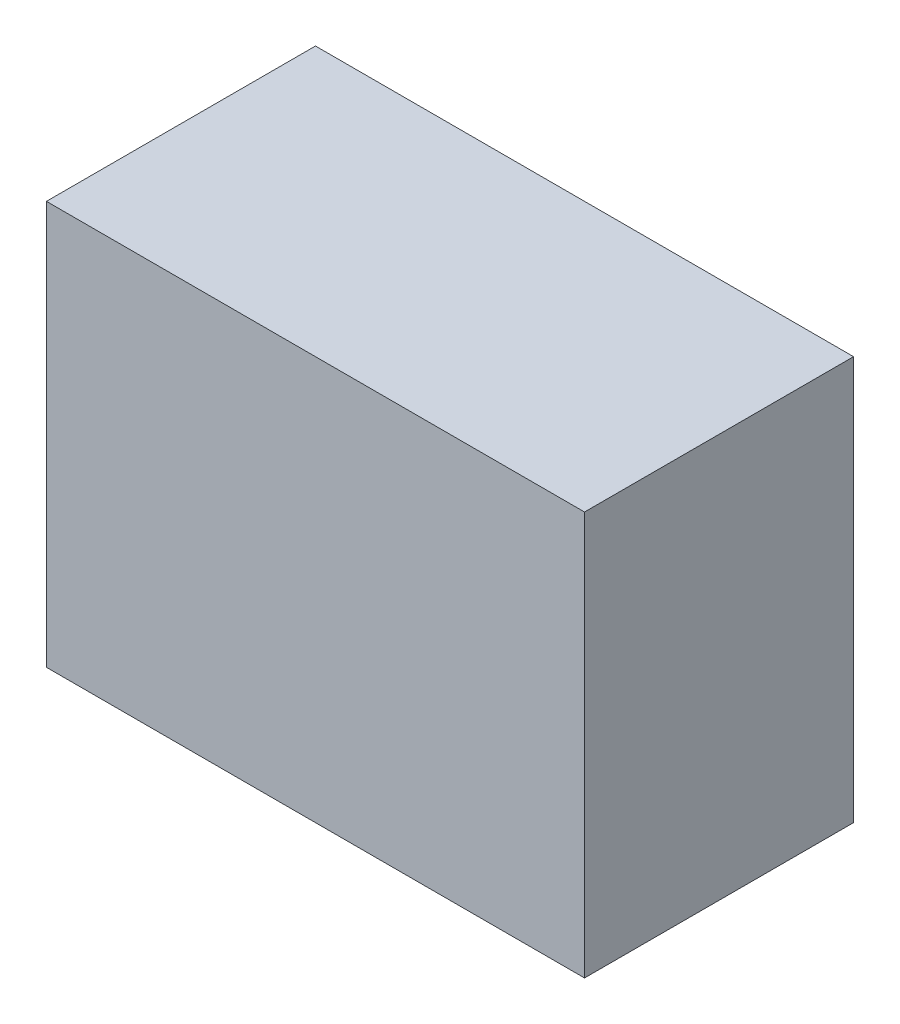
ISO-10303-21;
HEADER;
FILE_DESCRIPTION(('STEP AP214'),'2;1');
FILE_NAME('part.step','',(''),(''),'','','');
FILE_SCHEMA(('AUTOMOTIVE_DESIGN { 1 0 10303 214 1 1 1 1 }'));
ENDSEC;
DATA;
#1=APPLICATION_CONTEXT('core data for automotive mechanical design processes');
#2=APPLICATION_PROTOCOL_DEFINITION('international standard','automotive_design',2000,#1);
#3=PRODUCT_CONTEXT('',#1,'mechanical');
#4=PRODUCT('Part','Part','',(#3));
#5=PRODUCT_RELATED_PRODUCT_CATEGORY('part','',(#4));
#6=PRODUCT_DEFINITION_FORMATION('','',#4);
#7=PRODUCT_DEFINITION_CONTEXT('part definition',#1,'design');
#8=PRODUCT_DEFINITION('design','',#6,#7);
#9=PRODUCT_DEFINITION_SHAPE('','',#8);
#10=(LENGTH_UNIT() NAMED_UNIT(*) SI_UNIT(.MILLI.,.METRE.));
#11=(NAMED_UNIT(*) PLANE_ANGLE_UNIT() SI_UNIT($,.RADIAN.));
#12=(NAMED_UNIT(*) SI_UNIT($,.STERADIAN.) SOLID_ANGLE_UNIT());
#13=UNCERTAINTY_MEASURE_WITH_UNIT(LENGTH_MEASURE(1.E-05),#10,'distance_accuracy_value','');
#14=(GEOMETRIC_REPRESENTATION_CONTEXT(3) GLOBAL_UNCERTAINTY_ASSIGNED_CONTEXT((#13)) GLOBAL_UNIT_ASSIGNED_CONTEXT((#10,
#11,#12)) REPRESENTATION_CONTEXT('',''));
#15=CARTESIAN_POINT('',(0.,0.,0.));
#16=DIRECTION('',(0.,0.,1.));
#17=DIRECTION('',(1.,0.,0.));
#18=AXIS2_PLACEMENT_3D('',#15,#16,#17);
#19=CARTESIAN_POINT('',(10.,-7.5,-10.));
#20=DIRECTION('',(1.,0.,0.));
#21=DIRECTION('',(0.,0.,-1.));
#22=AXIS2_PLACEMENT_3D('',#19,#20,#21);
#23=PLANE('',#22);
#24=DIRECTION('',(0.,1.,0.));
#25=VECTOR('',#24,1.);
#26=CARTESIAN_POINT('',(10.,-7.5,0.));
#27=LINE('',#26,#25);
#28=CARTESIAN_POINT('',(10.,-7.5,0.));
#29=VERTEX_POINT('',#28);
#30=CARTESIAN_POINT('',(10.,7.5,0.));
#31=VERTEX_POINT('',#30);
#32=EDGE_CURVE('E103',#29,#31,#27,.T.);
#33=ORIENTED_EDGE('',*,*,#32,.F.);
#34=DIRECTION('',(0.,0.,1.));
#35=VECTOR('',#34,1.);
#36=CARTESIAN_POINT('',(10.,-7.5,-10.));
#37=LINE('',#36,#35);
#38=CARTESIAN_POINT('',(10.,-7.5,-10.));
#39=VERTEX_POINT('',#38);
#40=EDGE_CURVE('E11',#39,#29,#37,.T.);
#41=ORIENTED_EDGE('',*,*,#40,.F.);
#42=DIRECTION('',(0.,1.,0.));
#43=VECTOR('',#42,1.);
#44=CARTESIAN_POINT('',(10.,-7.5,-10.));
#45=LINE('',#44,#43);
#46=CARTESIAN_POINT('',(10.,7.5,-10.));
#47=VERTEX_POINT('',#46);
#48=EDGE_CURVE('E100',#39,#47,#45,.T.);
#49=ORIENTED_EDGE('',*,*,#48,.T.);
#50=DIRECTION('',(0.,0.,1.));
#51=VECTOR('',#50,1.);
#52=CARTESIAN_POINT('',(10.,7.5,-10.));
#53=LINE('',#52,#51);
#54=EDGE_CURVE('E45',#47,#31,#53,.T.);
#55=ORIENTED_EDGE('',*,*,#54,.T.);
#56=EDGE_LOOP('',(#33,#41,#49,#55));
#57=FACE_BOUND('',#56,.T.);
#58=ADVANCED_FACE('F39',(#57),#23,.T.);
#59=CARTESIAN_POINT('',(-10.,-7.5,-10.));
#60=DIRECTION('',(0.,-1.,0.));
#61=DIRECTION('',(0.,0.,-1.));
#62=AXIS2_PLACEMENT_3D('',#59,#60,#61);
#63=PLANE('',#62);
#64=DIRECTION('',(1.,0.,0.));
#65=VECTOR('',#64,1.);
#66=CARTESIAN_POINT('',(-10.,-7.5,0.));
#67=LINE('',#66,#65);
#68=CARTESIAN_POINT('',(-10.,-7.5,0.));
#69=VERTEX_POINT('',#68);
#70=EDGE_CURVE('E97',#69,#29,#67,.T.);
#71=ORIENTED_EDGE('',*,*,#70,.F.);
#72=DIRECTION('',(0.,0.,1.));
#73=VECTOR('',#72,1.);
#74=CARTESIAN_POINT('',(-10.,-7.5,-10.));
#75=LINE('',#74,#73);
#76=CARTESIAN_POINT('',(-10.,-7.5,-10.));
#77=VERTEX_POINT('',#76);
#78=EDGE_CURVE('E48',#77,#69,#75,.T.);
#79=ORIENTED_EDGE('',*,*,#78,.F.);
#80=DIRECTION('',(1.,0.,0.));
#81=VECTOR('',#80,1.);
#82=CARTESIAN_POINT('',(-10.,-7.5,-10.));
#83=LINE('',#82,#81);
#84=EDGE_CURVE('E94',#77,#39,#83,.T.);
#85=ORIENTED_EDGE('',*,*,#84,.T.);
#86=ORIENTED_EDGE('',*,*,#40,.T.);
#87=EDGE_LOOP('',(#71,#79,#85,#86));
#88=FACE_BOUND('',#87,.T.);
#89=ADVANCED_FACE('F114',(#88),#63,.T.);
#90=CARTESIAN_POINT('',(-10.,-7.5,-10.));
#91=DIRECTION('',(-1.,0.,0.));
#92=DIRECTION('',(0.,0.,1.));
#93=AXIS2_PLACEMENT_3D('',#90,#91,#92);
#94=PLANE('',#93);
#95=DIRECTION('',(0.,-1.,0.));
#96=VECTOR('',#95,1.);
#97=CARTESIAN_POINT('',(-10.,-7.5,0.));
#98=LINE('',#97,#96);
#99=CARTESIAN_POINT('',(-10.,7.5,0.));
#100=VERTEX_POINT('',#99);
#101=EDGE_CURVE('E90',#100,#69,#98,.T.);
#102=ORIENTED_EDGE('',*,*,#101,.F.);
#103=DIRECTION('',(0.,0.,1.));
#104=VECTOR('',#103,1.);
#105=CARTESIAN_POINT('',(-10.,7.5,-10.));
#106=LINE('',#105,#104);
#107=CARTESIAN_POINT('',(-10.,7.5,-10.));
#108=VERTEX_POINT('',#107);
#109=EDGE_CURVE('E82',#108,#100,#106,.T.);
#110=ORIENTED_EDGE('',*,*,#109,.F.);
#111=DIRECTION('',(0.,-1.,0.));
#112=VECTOR('',#111,1.);
#113=CARTESIAN_POINT('',(-10.,-7.5,-10.));
#114=LINE('',#113,#112);
#115=EDGE_CURVE('E87',#108,#77,#114,.T.);
#116=ORIENTED_EDGE('',*,*,#115,.T.);
#117=ORIENTED_EDGE('',*,*,#78,.T.);
#118=EDGE_LOOP('',(#102,#110,#116,#117));
#119=FACE_BOUND('',#118,.T.);
#120=ADVANCED_FACE('F88',(#119),#94,.T.);
#121=CARTESIAN_POINT('',(-10.,7.5,-10.));
#122=DIRECTION('',(0.,1.,0.));
#123=DIRECTION('',(0.,0.,1.));
#124=AXIS2_PLACEMENT_3D('',#121,#122,#123);
#125=PLANE('',#124);
#126=DIRECTION('',(-1.,0.,0.));
#127=VECTOR('',#126,1.);
#128=CARTESIAN_POINT('',(-10.,7.5,0.));
#129=LINE('',#128,#127);
#130=EDGE_CURVE('E106',#31,#100,#129,.T.);
#131=ORIENTED_EDGE('',*,*,#130,.F.);
#132=ORIENTED_EDGE('',*,*,#54,.F.);
#133=DIRECTION('',(-1.,0.,0.));
#134=VECTOR('',#133,1.);
#135=CARTESIAN_POINT('',(-10.,7.5,-10.));
#136=LINE('',#135,#134);
#137=EDGE_CURVE('E91',#47,#108,#136,.T.);
#138=ORIENTED_EDGE('',*,*,#137,.T.);
#139=ORIENTED_EDGE('',*,*,#109,.T.);
#140=EDGE_LOOP('',(#131,#132,#138,#139));
#141=FACE_BOUND('',#140,.T.);
#142=ADVANCED_FACE('F96',(#141),#125,.T.);
#143=CARTESIAN_POINT('',(0.,0.,-10.));
#144=DIRECTION('',(0.,0.,-1.));
#145=DIRECTION('',(-1.,0.,0.));
#146=AXIS2_PLACEMENT_3D('',#143,#144,#145);
#147=PLANE('',#146);
#148=ORIENTED_EDGE('',*,*,#48,.F.);
#149=ORIENTED_EDGE('',*,*,#84,.F.);
#150=ORIENTED_EDGE('',*,*,#115,.F.);
#151=ORIENTED_EDGE('',*,*,#137,.F.);
#152=EDGE_LOOP('',(#148,#149,#150,#151));
#153=FACE_BOUND('',#152,.T.);
#154=ADVANCED_FACE('F95',(#153),#147,.T.);
#155=CARTESIAN_POINT('',(0.,0.,0.));
#156=DIRECTION('',(0.,0.,-1.));
#157=DIRECTION('',(-1.,0.,0.));
#158=AXIS2_PLACEMENT_3D('',#155,#156,#157);
#159=PLANE('',#158);
#160=ORIENTED_EDGE('',*,*,#32,.T.);
#161=ORIENTED_EDGE('',*,*,#130,.T.);
#162=ORIENTED_EDGE('',*,*,#101,.T.);
#163=ORIENTED_EDGE('',*,*,#70,.T.);
#164=EDGE_LOOP('',(#160,#161,#162,#163));
#165=FACE_BOUND('',#164,.T.);
#166=ADVANCED_FACE('F115',(#165),#159,.F.);
#167=CLOSED_SHELL('',(#58,#89,#120,#142,#154,#166));
#168=MANIFOLD_SOLID_BREP('B2',#167);
#169=ADVANCED_BREP_SHAPE_REPRESENTATION('',(#18,#168),#14);
#170=SHAPE_DEFINITION_REPRESENTATION(#9,#169);
ENDSEC;
END-ISO-10303-21;
